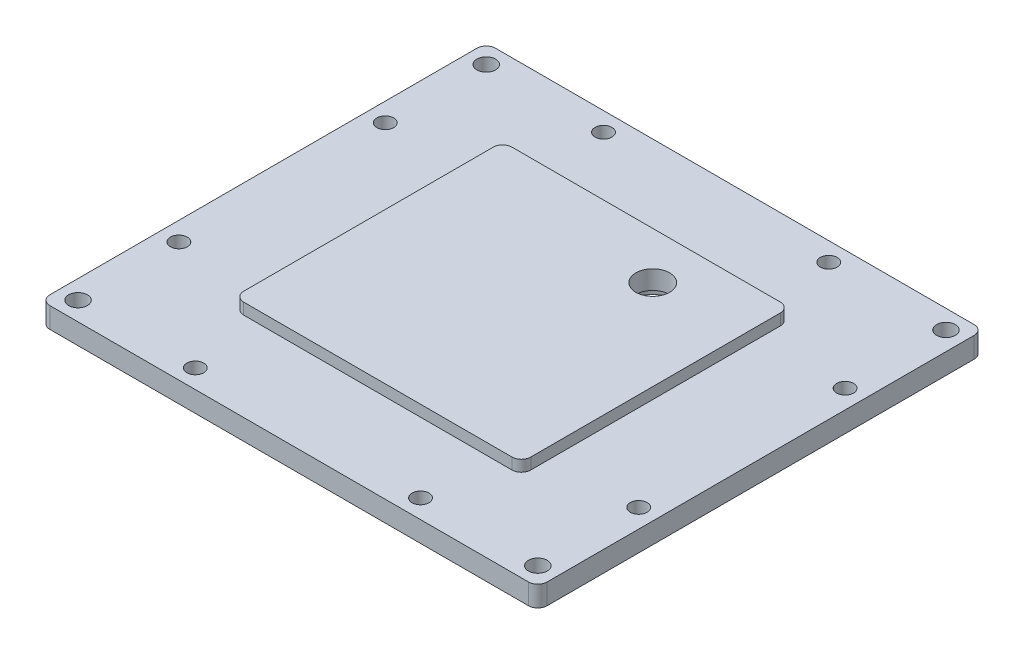
ISO-10303-21;
HEADER;
FILE_DESCRIPTION(('STEP AP214'),'2;1');
FILE_NAME('part.step','',(''),(''),'','','');
FILE_SCHEMA(('AUTOMOTIVE_DESIGN { 1 0 10303 214 1 1 1 1 }'));
ENDSEC;
DATA;
#1=APPLICATION_CONTEXT('core data for automotive mechanical design processes');
#2=APPLICATION_PROTOCOL_DEFINITION('international standard','automotive_design',2000,#1);
#3=PRODUCT_CONTEXT('',#1,'mechanical');
#4=PRODUCT('Part','Part','',(#3));
#5=PRODUCT_RELATED_PRODUCT_CATEGORY('part','',(#4));
#6=PRODUCT_DEFINITION_FORMATION('','',#4);
#7=PRODUCT_DEFINITION_CONTEXT('part definition',#1,'design');
#8=PRODUCT_DEFINITION('design','',#6,#7);
#9=PRODUCT_DEFINITION_SHAPE('','',#8);
#10=(LENGTH_UNIT() NAMED_UNIT(*) SI_UNIT(.MILLI.,.METRE.));
#11=(NAMED_UNIT(*) PLANE_ANGLE_UNIT() SI_UNIT($,.RADIAN.));
#12=(NAMED_UNIT(*) SI_UNIT($,.STERADIAN.) SOLID_ANGLE_UNIT());
#13=UNCERTAINTY_MEASURE_WITH_UNIT(LENGTH_MEASURE(1.E-05),#10,'distance_accuracy_value','');
#14=(GEOMETRIC_REPRESENTATION_CONTEXT(3) GLOBAL_UNCERTAINTY_ASSIGNED_CONTEXT((#13)) GLOBAL_UNIT_ASSIGNED_CONTEXT((#10,
#11,#12)) REPRESENTATION_CONTEXT('',''));
#15=CARTESIAN_POINT('',(0.,0.,0.));
#16=DIRECTION('',(0.,0.,1.));
#17=DIRECTION('',(1.,0.,0.));
#18=AXIS2_PLACEMENT_3D('',#15,#16,#17);
#19=CARTESIAN_POINT('',(57.,-11.,-93.));
#20=DIRECTION('',(0.,1.,0.));
#21=DIRECTION('',(0.,0.,1.));
#22=AXIS2_PLACEMENT_3D('',#19,#20,#21);
#23=CYLINDRICAL_SURFACE('',#22,18.);
#24=CARTESIAN_POINT('',(57.,23.,-93.));
#25=DIRECTION('',(0.,1.,0.));
#26=DIRECTION('',(0.,0.,1.));
#27=AXIS2_PLACEMENT_3D('',#24,#25,#26);
#28=CIRCLE('',#27,18.);
#29=CARTESIAN_POINT('',(57.,23.,-75.));
#30=VERTEX_POINT('',#29);
#31=EDGE_CURVE('E232',#30,#30,#28,.T.);
#32=ORIENTED_EDGE('',*,*,#31,.T.);
#33=EDGE_LOOP('',(#32));
#34=FACE_BOUND('',#33,.T.);
#35=CARTESIAN_POINT('',(57.,3.,-93.));
#36=DIRECTION('',(0.,-1.,0.));
#37=DIRECTION('',(0.,0.,-1.));
#38=AXIS2_PLACEMENT_3D('',#35,#36,#37);
#39=CIRCLE('',#38,18.);
#40=CARTESIAN_POINT('',(57.,3.,-111.));
#41=VERTEX_POINT('',#40);
#42=EDGE_CURVE('E228',#41,#41,#39,.F.);
#43=ORIENTED_EDGE('',*,*,#42,.F.);
#44=EDGE_LOOP('',(#43));
#45=FACE_BOUND('',#44,.T.);
#46=ADVANCED_FACE('F38',(#34,#45),#23,.F.);
#47=CARTESIAN_POINT('',(0.,11.,0.));
#48=DIRECTION('',(0.,-1.,0.));
#49=DIRECTION('',(0.,0.,-1.));
#50=AXIS2_PLACEMENT_3D('',#47,#48,#49);
#51=PLANE('',#50);
#52=CARTESIAN_POINT('',(120.,11.,217.5));
#53=DIRECTION('',(0.,1.,0.));
#54=DIRECTION('',(0.,0.,1.));
#55=AXIS2_PLACEMENT_3D('',#52,#53,#54);
#56=CIRCLE('',#55,9.);
#57=CARTESIAN_POINT('',(120.,11.,226.5));
#58=VERTEX_POINT('',#57);
#59=EDGE_CURVE('E387',#58,#58,#56,.T.);
#60=ORIENTED_EDGE('',*,*,#59,.F.);
#61=EDGE_LOOP('',(#60));
#62=FACE_BOUND('',#61,.T.);
#63=CARTESIAN_POINT('',(245.,11.,217.5));
#64=DIRECTION('',(0.,1.,0.));
#65=DIRECTION('',(0.,0.,1.));
#66=AXIS2_PLACEMENT_3D('',#63,#64,#65);
#67=CIRCLE('',#66,10.);
#68=CARTESIAN_POINT('',(245.,11.,227.5));
#69=VERTEX_POINT('',#68);
#70=EDGE_CURVE('E396',#69,#69,#67,.T.);
#71=ORIENTED_EDGE('',*,*,#70,.F.);
#72=EDGE_LOOP('',(#71));
#73=FACE_BOUND('',#72,.T.);
#74=CARTESIAN_POINT('',(245.,11.,110.));
#75=DIRECTION('',(0.,1.,0.));
#76=DIRECTION('',(0.,0.,1.));
#77=AXIS2_PLACEMENT_3D('',#74,#75,#76);
#78=CIRCLE('',#77,9.00000000000001);
#79=CARTESIAN_POINT('',(245.,11.,119.));
#80=VERTEX_POINT('',#79);
#81=EDGE_CURVE('E404',#80,#80,#78,.T.);
#82=ORIENTED_EDGE('',*,*,#81,.F.);
#83=EDGE_LOOP('',(#82));
#84=FACE_BOUND('',#83,.T.);
#85=CARTESIAN_POINT('',(245.,11.,-110.));
#86=DIRECTION('',(0.,1.,0.));
#87=DIRECTION('',(0.,0.,-1.));
#88=AXIS2_PLACEMENT_3D('',#85,#86,#87);
#89=CIRCLE('',#88,9.00000000000001);
#90=CARTESIAN_POINT('',(245.,11.,-119.));
#91=VERTEX_POINT('',#90);
#92=EDGE_CURVE('E412',#91,#91,#89,.T.);
#93=ORIENTED_EDGE('',*,*,#92,.F.);
#94=EDGE_LOOP('',(#93));
#95=FACE_BOUND('',#94,.T.);
#96=CARTESIAN_POINT('',(245.,11.,-217.5));
#97=DIRECTION('',(0.,1.,0.));
#98=DIRECTION('',(0.,0.,-1.));
#99=AXIS2_PLACEMENT_3D('',#96,#97,#98);
#100=CIRCLE('',#99,10.);
#101=CARTESIAN_POINT('',(245.,11.,-227.5));
#102=VERTEX_POINT('',#101);
#103=EDGE_CURVE('E355',#102,#102,#100,.T.);
#104=ORIENTED_EDGE('',*,*,#103,.F.);
#105=EDGE_LOOP('',(#104));
#106=FACE_BOUND('',#105,.T.);
#107=CARTESIAN_POINT('',(120.,11.,-217.5));
#108=DIRECTION('',(0.,1.,0.));
#109=DIRECTION('',(0.,0.,-1.));
#110=AXIS2_PLACEMENT_3D('',#107,#108,#109);
#111=CIRCLE('',#110,9.);
#112=CARTESIAN_POINT('',(120.,11.,-226.5));
#113=VERTEX_POINT('',#112);
#114=EDGE_CURVE('E364',#113,#113,#111,.T.);
#115=ORIENTED_EDGE('',*,*,#114,.F.);
#116=EDGE_LOOP('',(#115));
#117=FACE_BOUND('',#116,.T.);
#118=CARTESIAN_POINT('',(-245.,11.,-110.));
#119=DIRECTION('',(0.,1.,0.));
#120=DIRECTION('',(0.,0.,1.));
#121=AXIS2_PLACEMENT_3D('',#118,#119,#120);
#122=CIRCLE('',#121,9.00000000000001);
#123=CARTESIAN_POINT('',(-245.,11.,-101.));
#124=VERTEX_POINT('',#123);
#125=EDGE_CURVE('E372',#124,#124,#122,.T.);
#126=ORIENTED_EDGE('',*,*,#125,.F.);
#127=EDGE_LOOP('',(#126));
#128=FACE_BOUND('',#127,.T.);
#129=CARTESIAN_POINT('',(-120.,11.,-217.5));
#130=DIRECTION('',(0.,1.,0.));
#131=DIRECTION('',(0.,0.,1.));
#132=AXIS2_PLACEMENT_3D('',#129,#130,#131);
#133=CIRCLE('',#132,9.);
#134=CARTESIAN_POINT('',(-120.,11.,-208.5));
#135=VERTEX_POINT('',#134);
#136=EDGE_CURVE('E380',#135,#135,#133,.T.);
#137=ORIENTED_EDGE('',*,*,#136,.F.);
#138=EDGE_LOOP('',(#137));
#139=FACE_BOUND('',#138,.T.);
#140=CARTESIAN_POINT('',(-245.,11.,217.5));
#141=DIRECTION('',(0.,1.,0.));
#142=DIRECTION('',(0.,0.,-1.));
#143=AXIS2_PLACEMENT_3D('',#140,#141,#142);
#144=CIRCLE('',#143,10.);
#145=CARTESIAN_POINT('',(-245.,11.,207.5));
#146=VERTEX_POINT('',#145);
#147=EDGE_CURVE('E435',#146,#146,#144,.T.);
#148=ORIENTED_EDGE('',*,*,#147,.F.);
#149=EDGE_LOOP('',(#148));
#150=FACE_BOUND('',#149,.T.);
#151=CARTESIAN_POINT('',(-245.,11.,110.));
#152=DIRECTION('',(0.,1.,0.));
#153=DIRECTION('',(0.,0.,-1.));
#154=AXIS2_PLACEMENT_3D('',#151,#152,#153);
#155=CIRCLE('',#154,9.00000000000001);
#156=CARTESIAN_POINT('',(-245.,11.,101.));
#157=VERTEX_POINT('',#156);
#158=EDGE_CURVE('E419',#157,#157,#155,.T.);
#159=ORIENTED_EDGE('',*,*,#158,.F.);
#160=EDGE_LOOP('',(#159));
#161=FACE_BOUND('',#160,.T.);
#162=CARTESIAN_POINT('',(-120.,11.,217.5));
#163=DIRECTION('',(0.,1.,0.));
#164=DIRECTION('',(0.,0.,-1.));
#165=AXIS2_PLACEMENT_3D('',#162,#163,#164);
#166=CIRCLE('',#165,8.99999999999999);
#167=CARTESIAN_POINT('',(-120.,11.,208.5));
#168=VERTEX_POINT('',#167);
#169=EDGE_CURVE('E428',#168,#168,#166,.T.);
#170=ORIENTED_EDGE('',*,*,#169,.F.);
#171=EDGE_LOOP('',(#170));
#172=FACE_BOUND('',#171,.T.);
#173=CARTESIAN_POINT('',(-245.,11.,-217.5));
#174=DIRECTION('',(0.,1.,0.));
#175=DIRECTION('',(0.,0.,1.));
#176=AXIS2_PLACEMENT_3D('',#173,#174,#175);
#177=CIRCLE('',#176,10.);
#178=CARTESIAN_POINT('',(-245.,11.,-207.5));
#179=VERTEX_POINT('',#178);
#180=EDGE_CURVE('E347',#179,#179,#177,.T.);
#181=ORIENTED_EDGE('',*,*,#180,.F.);
#182=EDGE_LOOP('',(#181));
#183=FACE_BOUND('',#182,.T.);
#184=DIRECTION('',(0.,0.,-1.));
#185=VECTOR('',#184,1.);
#186=CARTESIAN_POINT('',(265.,11.,237.5));
#187=LINE('',#186,#185);
#188=CARTESIAN_POINT('',(265.,11.,227.5));
#189=VERTEX_POINT('',#188);
#190=CARTESIAN_POINT('',(265.,11.,-227.5));
#191=VERTEX_POINT('',#190);
#192=EDGE_CURVE('E198',#189,#191,#187,.T.);
#193=ORIENTED_EDGE('',*,*,#192,.T.);
#194=CARTESIAN_POINT('',(255.,11.,-227.5));
#195=DIRECTION('',(0.,-1.,0.));
#196=DIRECTION('',(0.,0.,-1.));
#197=AXIS2_PLACEMENT_3D('',#194,#195,#196);
#198=CIRCLE('',#197,10.);
#199=CARTESIAN_POINT('',(255.,11.,-237.5));
#200=VERTEX_POINT('',#199);
#201=EDGE_CURVE('E301',#191,#200,#198,.F.);
#202=ORIENTED_EDGE('',*,*,#201,.T.);
#203=DIRECTION('',(-1.,0.,0.));
#204=VECTOR('',#203,1.);
#205=CARTESIAN_POINT('',(-265.,11.,-237.5));
#206=LINE('',#205,#204);
#207=CARTESIAN_POINT('',(-255.,11.,-237.5));
#208=VERTEX_POINT('',#207);
#209=EDGE_CURVE('E202',#200,#208,#206,.T.);
#210=ORIENTED_EDGE('',*,*,#209,.T.);
#211=CARTESIAN_POINT('',(-255.,11.,-227.5));
#212=DIRECTION('',(0.,-1.,0.));
#213=DIRECTION('',(0.,0.,-1.));
#214=AXIS2_PLACEMENT_3D('',#211,#212,#213);
#215=CIRCLE('',#214,10.);
#216=CARTESIAN_POINT('',(-265.,11.,-227.5));
#217=VERTEX_POINT('',#216);
#218=EDGE_CURVE('E295',#208,#217,#215,.F.);
#219=ORIENTED_EDGE('',*,*,#218,.T.);
#220=DIRECTION('',(0.,0.,1.));
#221=VECTOR('',#220,1.);
#222=CARTESIAN_POINT('',(-265.,11.,237.5));
#223=LINE('',#222,#221);
#224=CARTESIAN_POINT('',(-265.,11.,227.5));
#225=VERTEX_POINT('',#224);
#226=EDGE_CURVE('E207',#217,#225,#223,.T.);
#227=ORIENTED_EDGE('',*,*,#226,.T.);
#228=CARTESIAN_POINT('',(-255.,11.,227.5));
#229=DIRECTION('',(0.,-1.,0.));
#230=DIRECTION('',(0.,0.,-1.));
#231=AXIS2_PLACEMENT_3D('',#228,#229,#230);
#232=CIRCLE('',#231,10.);
#233=CARTESIAN_POINT('',(-255.,11.,237.5));
#234=VERTEX_POINT('',#233);
#235=EDGE_CURVE('E61',#225,#234,#232,.F.);
#236=ORIENTED_EDGE('',*,*,#235,.T.);
#237=DIRECTION('',(1.,0.,0.));
#238=VECTOR('',#237,1.);
#239=CARTESIAN_POINT('',(-265.,11.,237.5));
#240=LINE('',#239,#238);
#241=CARTESIAN_POINT('',(255.,11.,237.5));
#242=VERTEX_POINT('',#241);
#243=EDGE_CURVE('E210',#234,#242,#240,.T.);
#244=ORIENTED_EDGE('',*,*,#243,.T.);
#245=CARTESIAN_POINT('',(255.,11.,227.5));
#246=DIRECTION('',(0.,-1.,0.));
#247=DIRECTION('',(0.,0.,-1.));
#248=AXIS2_PLACEMENT_3D('',#245,#246,#247);
#249=CIRCLE('',#248,10.);
#250=EDGE_CURVE('E298',#242,#189,#249,.F.);
#251=ORIENTED_EDGE('',*,*,#250,.T.);
#252=EDGE_LOOP('',(#193,#202,#210,#219,#227,#236,#244,#251));
#253=FACE_BOUND('',#252,.T.);
#254=DIRECTION('',(0.,0.,-1.));
#255=VECTOR('',#254,1.);
#256=CARTESIAN_POINT('',(153.,11.,143.));
#257=LINE('',#256,#255);
#258=CARTESIAN_POINT('',(153.,11.,133.));
#259=VERTEX_POINT('',#258);
#260=CARTESIAN_POINT('',(153.,11.,-133.));
#261=VERTEX_POINT('',#260);
#262=EDGE_CURVE('E183',#259,#261,#257,.T.);
#263=ORIENTED_EDGE('',*,*,#262,.F.);
#264=CARTESIAN_POINT('',(143.,11.,133.));
#265=DIRECTION('',(0.,-1.,0.));
#266=DIRECTION('',(0.,0.,-1.));
#267=AXIS2_PLACEMENT_3D('',#264,#265,#266);
#268=CIRCLE('',#267,10.);
#269=CARTESIAN_POINT('',(143.,11.,143.));
#270=VERTEX_POINT('',#269);
#271=EDGE_CURVE('E11',#259,#270,#268,.T.);
#272=ORIENTED_EDGE('',*,*,#271,.T.);
#273=DIRECTION('',(1.,0.,0.));
#274=VECTOR('',#273,1.);
#275=CARTESIAN_POINT('',(-153.,11.,143.));
#276=LINE('',#275,#274);
#277=CARTESIAN_POINT('',(-143.,11.,143.));
#278=VERTEX_POINT('',#277);
#279=EDGE_CURVE('E188',#278,#270,#276,.T.);
#280=ORIENTED_EDGE('',*,*,#279,.F.);
#281=CARTESIAN_POINT('',(-143.,11.,133.));
#282=DIRECTION('',(0.,-1.,0.));
#283=DIRECTION('',(0.,0.,-1.));
#284=AXIS2_PLACEMENT_3D('',#281,#282,#283);
#285=CIRCLE('',#284,10.);
#286=CARTESIAN_POINT('',(-153.,11.,133.));
#287=VERTEX_POINT('',#286);
#288=EDGE_CURVE('E47',#278,#287,#285,.T.);
#289=ORIENTED_EDGE('',*,*,#288,.T.);
#290=DIRECTION('',(0.,0.,1.));
#291=VECTOR('',#290,1.);
#292=CARTESIAN_POINT('',(-153.,11.,143.));
#293=LINE('',#292,#291);
#294=CARTESIAN_POINT('',(-153.,11.,-133.));
#295=VERTEX_POINT('',#294);
#296=EDGE_CURVE('E182',#295,#287,#293,.T.);
#297=ORIENTED_EDGE('',*,*,#296,.F.);
#298=CARTESIAN_POINT('',(-143.,11.,-133.));
#299=DIRECTION('',(0.,-1.,0.));
#300=DIRECTION('',(0.,0.,-1.));
#301=AXIS2_PLACEMENT_3D('',#298,#299,#300);
#302=CIRCLE('',#301,10.);
#303=CARTESIAN_POINT('',(-143.,11.,-143.));
#304=VERTEX_POINT('',#303);
#305=EDGE_CURVE('E164',#295,#304,#302,.T.);
#306=ORIENTED_EDGE('',*,*,#305,.T.);
#307=DIRECTION('',(-1.,0.,0.));
#308=VECTOR('',#307,1.);
#309=CARTESIAN_POINT('',(-153.,11.,-143.));
#310=LINE('',#309,#308);
#311=CARTESIAN_POINT('',(143.,11.,-143.));
#312=VERTEX_POINT('',#311);
#313=EDGE_CURVE('E171',#312,#304,#310,.T.);
#314=ORIENTED_EDGE('',*,*,#313,.F.);
#315=CARTESIAN_POINT('',(143.,11.,-133.));
#316=DIRECTION('',(0.,-1.,0.));
#317=DIRECTION('',(0.,0.,-1.));
#318=AXIS2_PLACEMENT_3D('',#315,#316,#317);
#319=CIRCLE('',#318,10.);
#320=EDGE_CURVE('E153',#312,#261,#319,.T.);
#321=ORIENTED_EDGE('',*,*,#320,.T.);
#322=EDGE_LOOP('',(#263,#272,#280,#289,#297,#306,#314,#321));
#323=FACE_BOUND('',#322,.T.);
#324=ADVANCED_FACE('F179',(#62,#73,#84,#95,#106,#117,#128,#139,#150,#161,#172,#183,#253,#323),
#51,.F.);
#325=CARTESIAN_POINT('',(265.,11.,237.5));
#326=DIRECTION('',(-1.,0.,0.));
#327=DIRECTION('',(0.,0.,1.));
#328=AXIS2_PLACEMENT_3D('',#325,#326,#327);
#329=PLANE('',#328);
#330=DIRECTION('',(0.,0.,-1.));
#331=VECTOR('',#330,1.);
#332=CARTESIAN_POINT('',(265.,-11.,237.5));
#333=LINE('',#332,#331);
#334=CARTESIAN_POINT('',(265.,-11.,227.5));
#335=VERTEX_POINT('',#334);
#336=CARTESIAN_POINT('',(265.,-11.,-227.5));
#337=VERTEX_POINT('',#336);
#338=EDGE_CURVE('E213',#335,#337,#333,.T.);
#339=ORIENTED_EDGE('',*,*,#338,.T.);
#340=DIRECTION('',(0.,-1.,0.));
#341=VECTOR('',#340,1.);
#342=CARTESIAN_POINT('',(265.,11.,-227.5));
#343=LINE('',#342,#341);
#344=EDGE_CURVE('E290',#337,#191,#343,.F.);
#345=ORIENTED_EDGE('',*,*,#344,.T.);
#346=ORIENTED_EDGE('',*,*,#192,.F.);
#347=DIRECTION('',(0.,-1.,0.));
#348=VECTOR('',#347,1.);
#349=CARTESIAN_POINT('',(265.,11.,227.5));
#350=LINE('',#349,#348);
#351=EDGE_CURVE('E286',#189,#335,#350,.T.);
#352=ORIENTED_EDGE('',*,*,#351,.T.);
#353=EDGE_LOOP('',(#339,#345,#346,#352));
#354=FACE_BOUND('',#353,.T.);
#355=ADVANCED_FACE('F517',(#354),#329,.F.);
#356=CARTESIAN_POINT('',(-265.,11.,-237.5));
#357=DIRECTION('',(0.,0.,1.));
#358=DIRECTION('',(1.,0.,0.));
#359=AXIS2_PLACEMENT_3D('',#356,#357,#358);
#360=PLANE('',#359);
#361=ORIENTED_EDGE('',*,*,#209,.F.);
#362=DIRECTION('',(0.,-1.,0.));
#363=VECTOR('',#362,1.);
#364=CARTESIAN_POINT('',(255.,11.,-237.5));
#365=LINE('',#364,#363);
#366=CARTESIAN_POINT('',(255.,-11.,-237.5));
#367=VERTEX_POINT('',#366);
#368=EDGE_CURVE('E270',#200,#367,#365,.T.);
#369=ORIENTED_EDGE('',*,*,#368,.T.);
#370=DIRECTION('',(-1.,0.,0.));
#371=VECTOR('',#370,1.);
#372=CARTESIAN_POINT('',(-265.,-11.,-237.5));
#373=LINE('',#372,#371);
#374=CARTESIAN_POINT('',(-255.,-11.,-237.5));
#375=VERTEX_POINT('',#374);
#376=EDGE_CURVE('E217',#367,#375,#373,.T.);
#377=ORIENTED_EDGE('',*,*,#376,.T.);
#378=DIRECTION('',(0.,-1.,0.));
#379=VECTOR('',#378,1.);
#380=CARTESIAN_POINT('',(-255.,11.,-237.5));
#381=LINE('',#380,#379);
#382=EDGE_CURVE('E267',#375,#208,#381,.F.);
#383=ORIENTED_EDGE('',*,*,#382,.T.);
#384=EDGE_LOOP('',(#361,#369,#377,#383));
#385=FACE_BOUND('',#384,.T.);
#386=ADVANCED_FACE('F498',(#385),#360,.F.);
#387=CARTESIAN_POINT('',(-265.,11.,237.5));
#388=DIRECTION('',(1.,0.,0.));
#389=DIRECTION('',(0.,0.,-1.));
#390=AXIS2_PLACEMENT_3D('',#387,#388,#389);
#391=PLANE('',#390);
#392=ORIENTED_EDGE('',*,*,#226,.F.);
#393=DIRECTION('',(0.,-1.,0.));
#394=VECTOR('',#393,1.);
#395=CARTESIAN_POINT('',(-265.,11.,-227.5));
#396=LINE('',#395,#394);
#397=CARTESIAN_POINT('',(-265.,-11.,-227.5));
#398=VERTEX_POINT('',#397);
#399=EDGE_CURVE('E165',#217,#398,#396,.T.);
#400=ORIENTED_EDGE('',*,*,#399,.T.);
#401=DIRECTION('',(0.,0.,1.));
#402=VECTOR('',#401,1.);
#403=CARTESIAN_POINT('',(-265.,-11.,237.5));
#404=LINE('',#403,#402);
#405=CARTESIAN_POINT('',(-265.,-11.,227.5));
#406=VERTEX_POINT('',#405);
#407=EDGE_CURVE('E222',#398,#406,#404,.T.);
#408=ORIENTED_EDGE('',*,*,#407,.T.);
#409=DIRECTION('',(0.,-1.,0.));
#410=VECTOR('',#409,1.);
#411=CARTESIAN_POINT('',(-265.,11.,227.5));
#412=LINE('',#411,#410);
#413=EDGE_CURVE('E310',#406,#225,#412,.F.);
#414=ORIENTED_EDGE('',*,*,#413,.T.);
#415=EDGE_LOOP('',(#392,#400,#408,#414));
#416=FACE_BOUND('',#415,.T.);
#417=ADVANCED_FACE('F506',(#416),#391,.F.);
#418=CARTESIAN_POINT('',(-265.,11.,237.5));
#419=DIRECTION('',(0.,0.,-1.));
#420=DIRECTION('',(-1.,0.,0.));
#421=AXIS2_PLACEMENT_3D('',#418,#419,#420);
#422=PLANE('',#421);
#423=DIRECTION('',(1.,0.,0.));
#424=VECTOR('',#423,1.);
#425=CARTESIAN_POINT('',(-265.,-11.,237.5));
#426=LINE('',#425,#424);
#427=CARTESIAN_POINT('',(-255.,-11.,237.5));
#428=VERTEX_POINT('',#427);
#429=CARTESIAN_POINT('',(255.,-11.,237.5));
#430=VERTEX_POINT('',#429);
#431=EDGE_CURVE('E203',#428,#430,#426,.T.);
#432=ORIENTED_EDGE('',*,*,#431,.T.);
#433=DIRECTION('',(0.,-1.,0.));
#434=VECTOR('',#433,1.);
#435=CARTESIAN_POINT('',(255.,11.,237.5));
#436=LINE('',#435,#434);
#437=EDGE_CURVE('E54',#430,#242,#436,.F.);
#438=ORIENTED_EDGE('',*,*,#437,.T.);
#439=ORIENTED_EDGE('',*,*,#243,.F.);
#440=DIRECTION('',(0.,-1.,0.));
#441=VECTOR('',#440,1.);
#442=CARTESIAN_POINT('',(-255.,11.,237.5));
#443=LINE('',#442,#441);
#444=EDGE_CURVE('E304',#234,#428,#443,.T.);
#445=ORIENTED_EDGE('',*,*,#444,.T.);
#446=EDGE_LOOP('',(#432,#438,#439,#445));
#447=FACE_BOUND('',#446,.T.);
#448=ADVANCED_FACE('F466',(#447),#422,.F.);
#449=CARTESIAN_POINT('',(0.,-11.,0.));
#450=DIRECTION('',(0.,-1.,0.));
#451=DIRECTION('',(0.,0.,-1.));
#452=AXIS2_PLACEMENT_3D('',#449,#450,#451);
#453=PLANE('',#452);
#454=CARTESIAN_POINT('',(57.,-11.,-93.));
#455=DIRECTION('',(0.,-1.,0.));
#456=DIRECTION('',(0.,0.,-1.));
#457=AXIS2_PLACEMENT_3D('',#454,#455,#456);
#458=CIRCLE('',#457,32.5);
#459=CARTESIAN_POINT('',(57.,-11.,-125.5));
#460=VERTEX_POINT('',#459);
#461=EDGE_CURVE('E445',#460,#460,#458,.T.);
#462=ORIENTED_EDGE('',*,*,#461,.F.);
#463=EDGE_LOOP('',(#462));
#464=FACE_BOUND('',#463,.T.);
#465=CARTESIAN_POINT('',(120.,-11.,217.5));
#466=DIRECTION('',(0.,1.,0.));
#467=DIRECTION('',(0.,0.,1.));
#468=AXIS2_PLACEMENT_3D('',#465,#466,#467);
#469=CIRCLE('',#468,9.);
#470=CARTESIAN_POINT('',(120.,-11.,226.5));
#471=VERTEX_POINT('',#470);
#472=EDGE_CURVE('E391',#471,#471,#469,.T.);
#473=ORIENTED_EDGE('',*,*,#472,.T.);
#474=EDGE_LOOP('',(#473));
#475=FACE_BOUND('',#474,.T.);
#476=CARTESIAN_POINT('',(245.,-11.,217.5));
#477=DIRECTION('',(0.,1.,0.));
#478=DIRECTION('',(0.,0.,1.));
#479=AXIS2_PLACEMENT_3D('',#476,#477,#478);
#480=CIRCLE('',#479,10.);
#481=CARTESIAN_POINT('',(245.,-11.,227.5));
#482=VERTEX_POINT('',#481);
#483=EDGE_CURVE('E400',#482,#482,#480,.T.);
#484=ORIENTED_EDGE('',*,*,#483,.T.);
#485=EDGE_LOOP('',(#484));
#486=FACE_BOUND('',#485,.T.);
#487=CARTESIAN_POINT('',(245.,-11.,110.));
#488=DIRECTION('',(0.,1.,0.));
#489=DIRECTION('',(0.,0.,1.));
#490=AXIS2_PLACEMENT_3D('',#487,#488,#489);
#491=CIRCLE('',#490,9.00000000000001);
#492=CARTESIAN_POINT('',(245.,-11.,119.));
#493=VERTEX_POINT('',#492);
#494=EDGE_CURVE('E408',#493,#493,#491,.T.);
#495=ORIENTED_EDGE('',*,*,#494,.T.);
#496=EDGE_LOOP('',(#495));
#497=FACE_BOUND('',#496,.T.);
#498=CARTESIAN_POINT('',(245.,-11.,-110.));
#499=DIRECTION('',(0.,1.,0.));
#500=DIRECTION('',(0.,0.,-1.));
#501=AXIS2_PLACEMENT_3D('',#498,#499,#500);
#502=CIRCLE('',#501,9.00000000000001);
#503=CARTESIAN_POINT('',(245.,-11.,-119.));
#504=VERTEX_POINT('',#503);
#505=EDGE_CURVE('E360',#504,#504,#502,.T.);
#506=ORIENTED_EDGE('',*,*,#505,.T.);
#507=EDGE_LOOP('',(#506));
#508=FACE_BOUND('',#507,.T.);
#509=CARTESIAN_POINT('',(245.,-11.,-217.5));
#510=DIRECTION('',(0.,1.,0.));
#511=DIRECTION('',(0.,0.,-1.));
#512=AXIS2_PLACEMENT_3D('',#509,#510,#511);
#513=CIRCLE('',#512,10.);
#514=CARTESIAN_POINT('',(245.,-11.,-227.5));
#515=VERTEX_POINT('',#514);
#516=EDGE_CURVE('E359',#515,#515,#513,.T.);
#517=ORIENTED_EDGE('',*,*,#516,.T.);
#518=EDGE_LOOP('',(#517));
#519=FACE_BOUND('',#518,.T.);
#520=CARTESIAN_POINT('',(120.,-11.,-217.5));
#521=DIRECTION('',(0.,1.,0.));
#522=DIRECTION('',(0.,0.,-1.));
#523=AXIS2_PLACEMENT_3D('',#520,#521,#522);
#524=CIRCLE('',#523,9.);
#525=CARTESIAN_POINT('',(120.,-11.,-226.5));
#526=VERTEX_POINT('',#525);
#527=EDGE_CURVE('E368',#526,#526,#524,.T.);
#528=ORIENTED_EDGE('',*,*,#527,.T.);
#529=EDGE_LOOP('',(#528));
#530=FACE_BOUND('',#529,.T.);
#531=CARTESIAN_POINT('',(-245.,-11.,-110.));
#532=DIRECTION('',(0.,1.,0.));
#533=DIRECTION('',(0.,0.,1.));
#534=AXIS2_PLACEMENT_3D('',#531,#532,#533);
#535=CIRCLE('',#534,9.00000000000001);
#536=CARTESIAN_POINT('',(-245.,-11.,-101.));
#537=VERTEX_POINT('',#536);
#538=EDGE_CURVE('E376',#537,#537,#535,.T.);
#539=ORIENTED_EDGE('',*,*,#538,.T.);
#540=EDGE_LOOP('',(#539));
#541=FACE_BOUND('',#540,.T.);
#542=CARTESIAN_POINT('',(-120.,-11.,-217.5));
#543=DIRECTION('',(0.,1.,0.));
#544=DIRECTION('',(0.,0.,1.));
#545=AXIS2_PLACEMENT_3D('',#542,#543,#544);
#546=CIRCLE('',#545,9.);
#547=CARTESIAN_POINT('',(-120.,-11.,-208.5));
#548=VERTEX_POINT('',#547);
#549=EDGE_CURVE('E351',#548,#548,#546,.T.);
#550=ORIENTED_EDGE('',*,*,#549,.T.);
#551=EDGE_LOOP('',(#550));
#552=FACE_BOUND('',#551,.T.);
#553=CARTESIAN_POINT('',(-245.,-11.,217.5));
#554=DIRECTION('',(0.,1.,0.));
#555=DIRECTION('',(0.,0.,-1.));
#556=AXIS2_PLACEMENT_3D('',#553,#554,#555);
#557=CIRCLE('',#556,10.);
#558=CARTESIAN_POINT('',(-245.,-11.,207.5));
#559=VERTEX_POINT('',#558);
#560=EDGE_CURVE('E424',#559,#559,#557,.T.);
#561=ORIENTED_EDGE('',*,*,#560,.T.);
#562=EDGE_LOOP('',(#561));
#563=FACE_BOUND('',#562,.T.);
#564=CARTESIAN_POINT('',(-245.,-11.,110.));
#565=DIRECTION('',(0.,1.,0.));
#566=DIRECTION('',(0.,0.,-1.));
#567=AXIS2_PLACEMENT_3D('',#564,#565,#566);
#568=CIRCLE('',#567,9.00000000000001);
#569=CARTESIAN_POINT('',(-245.,-11.,101.));
#570=VERTEX_POINT('',#569);
#571=EDGE_CURVE('E423',#570,#570,#568,.T.);
#572=ORIENTED_EDGE('',*,*,#571,.T.);
#573=EDGE_LOOP('',(#572));
#574=FACE_BOUND('',#573,.T.);
#575=CARTESIAN_POINT('',(-120.,-11.,217.5));
#576=DIRECTION('',(0.,1.,0.));
#577=DIRECTION('',(0.,0.,-1.));
#578=AXIS2_PLACEMENT_3D('',#575,#576,#577);
#579=CIRCLE('',#578,8.99999999999999);
#580=CARTESIAN_POINT('',(-120.,-11.,208.5));
#581=VERTEX_POINT('',#580);
#582=EDGE_CURVE('E392',#581,#581,#579,.T.);
#583=ORIENTED_EDGE('',*,*,#582,.T.);
#584=EDGE_LOOP('',(#583));
#585=FACE_BOUND('',#584,.T.);
#586=CARTESIAN_POINT('',(-245.,-11.,-217.5));
#587=DIRECTION('',(0.,1.,0.));
#588=DIRECTION('',(0.,0.,1.));
#589=AXIS2_PLACEMENT_3D('',#586,#587,#588);
#590=CIRCLE('',#589,10.);
#591=CARTESIAN_POINT('',(-245.,-11.,-207.5));
#592=VERTEX_POINT('',#591);
#593=EDGE_CURVE('E190',#592,#592,#590,.T.);
#594=ORIENTED_EDGE('',*,*,#593,.T.);
#595=EDGE_LOOP('',(#594));
#596=FACE_BOUND('',#595,.T.);
#597=ORIENTED_EDGE('',*,*,#376,.F.);
#598=CARTESIAN_POINT('',(255.,-11.,-227.5));
#599=DIRECTION('',(0.,-1.,0.));
#600=DIRECTION('',(0.,0.,-1.));
#601=AXIS2_PLACEMENT_3D('',#598,#599,#600);
#602=CIRCLE('',#601,10.);
#603=EDGE_CURVE('E283',#367,#337,#602,.T.);
#604=ORIENTED_EDGE('',*,*,#603,.T.);
#605=ORIENTED_EDGE('',*,*,#338,.F.);
#606=CARTESIAN_POINT('',(255.,-11.,227.5));
#607=DIRECTION('',(0.,-1.,0.));
#608=DIRECTION('',(0.,0.,-1.));
#609=AXIS2_PLACEMENT_3D('',#606,#607,#608);
#610=CIRCLE('',#609,10.);
#611=EDGE_CURVE('E280',#335,#430,#610,.T.);
#612=ORIENTED_EDGE('',*,*,#611,.T.);
#613=ORIENTED_EDGE('',*,*,#431,.F.);
#614=CARTESIAN_POINT('',(-255.,-11.,227.5));
#615=DIRECTION('',(0.,-1.,0.));
#616=DIRECTION('',(0.,0.,-1.));
#617=AXIS2_PLACEMENT_3D('',#614,#615,#616);
#618=CIRCLE('',#617,10.);
#619=EDGE_CURVE('E274',#428,#406,#618,.T.);
#620=ORIENTED_EDGE('',*,*,#619,.T.);
#621=ORIENTED_EDGE('',*,*,#407,.F.);
#622=CARTESIAN_POINT('',(-255.,-11.,-227.5));
#623=DIRECTION('',(0.,-1.,0.));
#624=DIRECTION('',(0.,0.,-1.));
#625=AXIS2_PLACEMENT_3D('',#622,#623,#624);
#626=CIRCLE('',#625,10.);
#627=EDGE_CURVE('E277',#398,#375,#626,.T.);
#628=ORIENTED_EDGE('',*,*,#627,.T.);
#629=EDGE_LOOP('',(#597,#604,#605,#612,#613,#620,#621,#628));
#630=FACE_BOUND('',#629,.T.);
#631=ADVANCED_FACE('F462',(#464,#475,#486,#497,#508,#519,#530,#541,#552,#563,#574,#585,#596,
#630),#453,.T.);
#632=CARTESIAN_POINT('',(153.,23.,143.));
#633=DIRECTION('',(-1.,0.,0.));
#634=DIRECTION('',(0.,0.,1.));
#635=AXIS2_PLACEMENT_3D('',#632,#633,#634);
#636=PLANE('',#635);
#637=ORIENTED_EDGE('',*,*,#262,.T.);
#638=DIRECTION('',(0.,-1.,0.));
#639=VECTOR('',#638,1.);
#640=CARTESIAN_POINT('',(153.,23.,-133.));
#641=LINE('',#640,#639);
#642=CARTESIAN_POINT('',(153.,23.,-133.));
#643=VERTEX_POINT('',#642);
#644=EDGE_CURVE('E158',#261,#643,#641,.F.);
#645=ORIENTED_EDGE('',*,*,#644,.T.);
#646=DIRECTION('',(0.,0.,-1.));
#647=VECTOR('',#646,1.);
#648=CARTESIAN_POINT('',(153.,23.,143.));
#649=LINE('',#648,#647);
#650=CARTESIAN_POINT('',(153.,23.,133.));
#651=VERTEX_POINT('',#650);
#652=EDGE_CURVE('E197',#651,#643,#649,.T.);
#653=ORIENTED_EDGE('',*,*,#652,.F.);
#654=DIRECTION('',(0.,-1.,0.));
#655=VECTOR('',#654,1.);
#656=CARTESIAN_POINT('',(153.,23.,133.));
#657=LINE('',#656,#655);
#658=EDGE_CURVE('E176',#651,#259,#657,.T.);
#659=ORIENTED_EDGE('',*,*,#658,.T.);
#660=EDGE_LOOP('',(#637,#645,#653,#659));
#661=FACE_BOUND('',#660,.T.);
#662=ADVANCED_FACE('F465',(#661),#636,.F.);
#663=CARTESIAN_POINT('',(-153.,23.,-143.));
#664=DIRECTION('',(0.,0.,1.));
#665=DIRECTION('',(1.,0.,0.));
#666=AXIS2_PLACEMENT_3D('',#663,#664,#665);
#667=PLANE('',#666);
#668=DIRECTION('',(-1.,0.,0.));
#669=VECTOR('',#668,1.);
#670=CARTESIAN_POINT('',(-153.,23.,-143.));
#671=LINE('',#670,#669);
#672=CARTESIAN_POINT('',(143.,23.,-143.));
#673=VERTEX_POINT('',#672);
#674=CARTESIAN_POINT('',(-143.,23.,-143.));
#675=VERTEX_POINT('',#674);
#676=EDGE_CURVE('E174',#673,#675,#671,.T.);
#677=ORIENTED_EDGE('',*,*,#676,.F.);
#678=DIRECTION('',(0.,-1.,0.));
#679=VECTOR('',#678,1.);
#680=CARTESIAN_POINT('',(143.,23.,-143.));
#681=LINE('',#680,#679);
#682=EDGE_CURVE('E157',#673,#312,#681,.T.);
#683=ORIENTED_EDGE('',*,*,#682,.T.);
#684=ORIENTED_EDGE('',*,*,#313,.T.);
#685=DIRECTION('',(0.,-1.,0.));
#686=VECTOR('',#685,1.);
#687=CARTESIAN_POINT('',(-143.,23.,-143.));
#688=LINE('',#687,#686);
#689=EDGE_CURVE('E177',#304,#675,#688,.F.);
#690=ORIENTED_EDGE('',*,*,#689,.T.);
#691=EDGE_LOOP('',(#677,#683,#684,#690));
#692=FACE_BOUND('',#691,.T.);
#693=ADVANCED_FACE('F170',(#692),#667,.F.);
#694=CARTESIAN_POINT('',(-153.,23.,143.));
#695=DIRECTION('',(1.,0.,0.));
#696=DIRECTION('',(0.,0.,-1.));
#697=AXIS2_PLACEMENT_3D('',#694,#695,#696);
#698=PLANE('',#697);
#699=DIRECTION('',(0.,0.,1.));
#700=VECTOR('',#699,1.);
#701=CARTESIAN_POINT('',(-153.,23.,143.));
#702=LINE('',#701,#700);
#703=CARTESIAN_POINT('',(-153.,23.,-133.));
#704=VERTEX_POINT('',#703);
#705=CARTESIAN_POINT('',(-153.,23.,133.));
#706=VERTEX_POINT('',#705);
#707=EDGE_CURVE('E335',#704,#706,#702,.T.);
#708=ORIENTED_EDGE('',*,*,#707,.F.);
#709=DIRECTION('',(0.,-1.,0.));
#710=VECTOR('',#709,1.);
#711=CARTESIAN_POINT('',(-153.,23.,-133.));
#712=LINE('',#711,#710);
#713=EDGE_CURVE('E256',#704,#295,#712,.T.);
#714=ORIENTED_EDGE('',*,*,#713,.T.);
#715=ORIENTED_EDGE('',*,*,#296,.T.);
#716=DIRECTION('',(0.,-1.,0.));
#717=VECTOR('',#716,1.);
#718=CARTESIAN_POINT('',(-153.,23.,133.));
#719=LINE('',#718,#717);
#720=EDGE_CURVE('E253',#287,#706,#719,.F.);
#721=ORIENTED_EDGE('',*,*,#720,.T.);
#722=EDGE_LOOP('',(#708,#714,#715,#721));
#723=FACE_BOUND('',#722,.T.);
#724=ADVANCED_FACE('F324',(#723),#698,.F.);
#725=CARTESIAN_POINT('',(-153.,23.,143.));
#726=DIRECTION('',(0.,0.,-1.));
#727=DIRECTION('',(-1.,0.,0.));
#728=AXIS2_PLACEMENT_3D('',#725,#726,#727);
#729=PLANE('',#728);
#730=DIRECTION('',(1.,0.,0.));
#731=VECTOR('',#730,1.);
#732=CARTESIAN_POINT('',(-153.,23.,143.));
#733=LINE('',#732,#731);
#734=CARTESIAN_POINT('',(-143.,23.,143.));
#735=VERTEX_POINT('',#734);
#736=CARTESIAN_POINT('',(143.,23.,143.));
#737=VERTEX_POINT('',#736);
#738=EDGE_CURVE('E218',#735,#737,#733,.T.);
#739=ORIENTED_EDGE('',*,*,#738,.F.);
#740=DIRECTION('',(0.,-1.,0.));
#741=VECTOR('',#740,1.);
#742=CARTESIAN_POINT('',(-143.,23.,143.));
#743=LINE('',#742,#741);
#744=EDGE_CURVE('E263',#735,#278,#743,.T.);
#745=ORIENTED_EDGE('',*,*,#744,.T.);
#746=ORIENTED_EDGE('',*,*,#279,.T.);
#747=DIRECTION('',(0.,-1.,0.));
#748=VECTOR('',#747,1.);
#749=CARTESIAN_POINT('',(143.,23.,143.));
#750=LINE('',#749,#748);
#751=EDGE_CURVE('E260',#270,#737,#750,.F.);
#752=ORIENTED_EDGE('',*,*,#751,.T.);
#753=EDGE_LOOP('',(#739,#745,#746,#752));
#754=FACE_BOUND('',#753,.T.);
#755=ADVANCED_FACE('F337',(#754),#729,.F.);
#756=CARTESIAN_POINT('',(0.,23.,0.));
#757=DIRECTION('',(0.,-1.,0.));
#758=DIRECTION('',(0.,0.,-1.));
#759=AXIS2_PLACEMENT_3D('',#756,#757,#758);
#760=PLANE('',#759);
#761=ORIENTED_EDGE('',*,*,#31,.F.);
#762=EDGE_LOOP('',(#761));
#763=FACE_BOUND('',#762,.T.);
#764=ORIENTED_EDGE('',*,*,#652,.T.);
#765=CARTESIAN_POINT('',(143.,23.,-133.));
#766=DIRECTION('',(0.,-1.,0.));
#767=DIRECTION('',(0.,0.,-1.));
#768=AXIS2_PLACEMENT_3D('',#765,#766,#767);
#769=CIRCLE('',#768,10.);
#770=EDGE_CURVE('E250',#643,#673,#769,.F.);
#771=ORIENTED_EDGE('',*,*,#770,.T.);
#772=ORIENTED_EDGE('',*,*,#676,.T.);
#773=CARTESIAN_POINT('',(-143.,23.,-133.));
#774=DIRECTION('',(0.,-1.,0.));
#775=DIRECTION('',(0.,0.,-1.));
#776=AXIS2_PLACEMENT_3D('',#773,#774,#775);
#777=CIRCLE('',#776,10.);
#778=EDGE_CURVE('E247',#675,#704,#777,.F.);
#779=ORIENTED_EDGE('',*,*,#778,.T.);
#780=ORIENTED_EDGE('',*,*,#707,.T.);
#781=CARTESIAN_POINT('',(-143.,23.,133.));
#782=DIRECTION('',(0.,-1.,0.));
#783=DIRECTION('',(0.,0.,-1.));
#784=AXIS2_PLACEMENT_3D('',#781,#782,#783);
#785=CIRCLE('',#784,10.);
#786=EDGE_CURVE('E244',#706,#735,#785,.F.);
#787=ORIENTED_EDGE('',*,*,#786,.T.);
#788=ORIENTED_EDGE('',*,*,#738,.T.);
#789=CARTESIAN_POINT('',(143.,23.,133.));
#790=DIRECTION('',(0.,-1.,0.));
#791=DIRECTION('',(0.,0.,-1.));
#792=AXIS2_PLACEMENT_3D('',#789,#790,#791);
#793=CIRCLE('',#792,10.);
#794=EDGE_CURVE('E241',#737,#651,#793,.F.);
#795=ORIENTED_EDGE('',*,*,#794,.T.);
#796=EDGE_LOOP('',(#764,#771,#772,#779,#780,#787,#788,#795));
#797=FACE_BOUND('',#796,.T.);
#798=ADVANCED_FACE('F333',(#763,#797),#760,.F.);
#799=CARTESIAN_POINT('',(-245.,-11.,-217.5));
#800=DIRECTION('',(0.,1.,0.));
#801=DIRECTION('',(0.,0.,1.));
#802=AXIS2_PLACEMENT_3D('',#799,#800,#801);
#803=CYLINDRICAL_SURFACE('',#802,10.);
#804=ORIENTED_EDGE('',*,*,#593,.F.);
#805=EDGE_LOOP('',(#804));
#806=FACE_BOUND('',#805,.T.);
#807=ORIENTED_EDGE('',*,*,#180,.T.);
#808=EDGE_LOOP('',(#807));
#809=FACE_BOUND('',#808,.T.);
#810=ADVANCED_FACE('F553',(#806,#809),#803,.F.);
#811=CARTESIAN_POINT('',(-120.,-11.,217.5));
#812=DIRECTION('',(0.,1.,0.));
#813=DIRECTION('',(0.,0.,1.));
#814=AXIS2_PLACEMENT_3D('',#811,#812,#813);
#815=CYLINDRICAL_SURFACE('',#814,8.99999999999999);
#816=ORIENTED_EDGE('',*,*,#582,.F.);
#817=EDGE_LOOP('',(#816));
#818=FACE_BOUND('',#817,.T.);
#819=ORIENTED_EDGE('',*,*,#169,.T.);
#820=EDGE_LOOP('',(#819));
#821=FACE_BOUND('',#820,.T.);
#822=ADVANCED_FACE('F550',(#818,#821),#815,.F.);
#823=CARTESIAN_POINT('',(-245.,-11.,110.));
#824=DIRECTION('',(0.,1.,0.));
#825=DIRECTION('',(0.,0.,1.));
#826=AXIS2_PLACEMENT_3D('',#823,#824,#825);
#827=CYLINDRICAL_SURFACE('',#826,9.00000000000001);
#828=ORIENTED_EDGE('',*,*,#571,.F.);
#829=EDGE_LOOP('',(#828));
#830=FACE_BOUND('',#829,.T.);
#831=ORIENTED_EDGE('',*,*,#158,.T.);
#832=EDGE_LOOP('',(#831));
#833=FACE_BOUND('',#832,.T.);
#834=ADVANCED_FACE('F548',(#830,#833),#827,.F.);
#835=CARTESIAN_POINT('',(-245.,-11.,217.5));
#836=DIRECTION('',(0.,1.,0.));
#837=DIRECTION('',(0.,0.,1.));
#838=AXIS2_PLACEMENT_3D('',#835,#836,#837);
#839=CYLINDRICAL_SURFACE('',#838,10.);
#840=ORIENTED_EDGE('',*,*,#560,.F.);
#841=EDGE_LOOP('',(#840));
#842=FACE_BOUND('',#841,.T.);
#843=ORIENTED_EDGE('',*,*,#147,.T.);
#844=EDGE_LOOP('',(#843));
#845=FACE_BOUND('',#844,.T.);
#846=ADVANCED_FACE('F544',(#842,#845),#839,.F.);
#847=CARTESIAN_POINT('',(-120.,-11.,-217.5));
#848=DIRECTION('',(0.,1.,0.));
#849=DIRECTION('',(0.,0.,1.));
#850=AXIS2_PLACEMENT_3D('',#847,#848,#849);
#851=CYLINDRICAL_SURFACE('',#850,9.);
#852=ORIENTED_EDGE('',*,*,#549,.F.);
#853=EDGE_LOOP('',(#852));
#854=FACE_BOUND('',#853,.T.);
#855=ORIENTED_EDGE('',*,*,#136,.T.);
#856=EDGE_LOOP('',(#855));
#857=FACE_BOUND('',#856,.T.);
#858=ADVANCED_FACE('F547',(#854,#857),#851,.F.);
#859=CARTESIAN_POINT('',(-245.,-11.,-110.));
#860=DIRECTION('',(0.,1.,0.));
#861=DIRECTION('',(0.,0.,1.));
#862=AXIS2_PLACEMENT_3D('',#859,#860,#861);
#863=CYLINDRICAL_SURFACE('',#862,9.00000000000001);
#864=ORIENTED_EDGE('',*,*,#538,.F.);
#865=EDGE_LOOP('',(#864));
#866=FACE_BOUND('',#865,.T.);
#867=ORIENTED_EDGE('',*,*,#125,.T.);
#868=EDGE_LOOP('',(#867));
#869=FACE_BOUND('',#868,.T.);
#870=ADVANCED_FACE('F577',(#866,#869),#863,.F.);
#871=CARTESIAN_POINT('',(120.,-11.,-217.5));
#872=DIRECTION('',(0.,1.,0.));
#873=DIRECTION('',(0.,0.,1.));
#874=AXIS2_PLACEMENT_3D('',#871,#872,#873);
#875=CYLINDRICAL_SURFACE('',#874,9.);
#876=ORIENTED_EDGE('',*,*,#527,.F.);
#877=EDGE_LOOP('',(#876));
#878=FACE_BOUND('',#877,.T.);
#879=ORIENTED_EDGE('',*,*,#114,.T.);
#880=EDGE_LOOP('',(#879));
#881=FACE_BOUND('',#880,.T.);
#882=ADVANCED_FACE('F581',(#878,#881),#875,.F.);
#883=CARTESIAN_POINT('',(245.,-11.,-217.5));
#884=DIRECTION('',(0.,1.,0.));
#885=DIRECTION('',(0.,0.,1.));
#886=AXIS2_PLACEMENT_3D('',#883,#884,#885);
#887=CYLINDRICAL_SURFACE('',#886,10.);
#888=ORIENTED_EDGE('',*,*,#516,.F.);
#889=EDGE_LOOP('',(#888));
#890=FACE_BOUND('',#889,.T.);
#891=ORIENTED_EDGE('',*,*,#103,.T.);
#892=EDGE_LOOP('',(#891));
#893=FACE_BOUND('',#892,.T.);
#894=ADVANCED_FACE('F562',(#890,#893),#887,.F.);
#895=CARTESIAN_POINT('',(245.,-11.,-110.));
#896=DIRECTION('',(0.,1.,0.));
#897=DIRECTION('',(0.,0.,1.));
#898=AXIS2_PLACEMENT_3D('',#895,#896,#897);
#899=CYLINDRICAL_SURFACE('',#898,9.00000000000001);
#900=ORIENTED_EDGE('',*,*,#505,.F.);
#901=EDGE_LOOP('',(#900));
#902=FACE_BOUND('',#901,.T.);
#903=ORIENTED_EDGE('',*,*,#92,.T.);
#904=EDGE_LOOP('',(#903));
#905=FACE_BOUND('',#904,.T.);
#906=ADVANCED_FACE('F558',(#902,#905),#899,.F.);
#907=CARTESIAN_POINT('',(245.,-11.,110.));
#908=DIRECTION('',(0.,1.,0.));
#909=DIRECTION('',(0.,0.,1.));
#910=AXIS2_PLACEMENT_3D('',#907,#908,#909);
#911=CYLINDRICAL_SURFACE('',#910,9.00000000000001);
#912=ORIENTED_EDGE('',*,*,#494,.F.);
#913=EDGE_LOOP('',(#912));
#914=FACE_BOUND('',#913,.T.);
#915=ORIENTED_EDGE('',*,*,#81,.T.);
#916=EDGE_LOOP('',(#915));
#917=FACE_BOUND('',#916,.T.);
#918=ADVANCED_FACE('F561',(#914,#917),#911,.F.);
#919=CARTESIAN_POINT('',(245.,-11.,217.5));
#920=DIRECTION('',(0.,1.,0.));
#921=DIRECTION('',(0.,0.,1.));
#922=AXIS2_PLACEMENT_3D('',#919,#920,#921);
#923=CYLINDRICAL_SURFACE('',#922,10.);
#924=ORIENTED_EDGE('',*,*,#483,.F.);
#925=EDGE_LOOP('',(#924));
#926=FACE_BOUND('',#925,.T.);
#927=ORIENTED_EDGE('',*,*,#70,.T.);
#928=EDGE_LOOP('',(#927));
#929=FACE_BOUND('',#928,.T.);
#930=ADVANCED_FACE('F566',(#926,#929),#923,.F.);
#931=CARTESIAN_POINT('',(120.,-11.,217.5));
#932=DIRECTION('',(0.,1.,0.));
#933=DIRECTION('',(0.,0.,1.));
#934=AXIS2_PLACEMENT_3D('',#931,#932,#933);
#935=CYLINDRICAL_SURFACE('',#934,9.);
#936=ORIENTED_EDGE('',*,*,#472,.F.);
#937=EDGE_LOOP('',(#936));
#938=FACE_BOUND('',#937,.T.);
#939=ORIENTED_EDGE('',*,*,#59,.T.);
#940=EDGE_LOOP('',(#939));
#941=FACE_BOUND('',#940,.T.);
#942=ADVANCED_FACE('F570',(#938,#941),#935,.F.);
#943=CARTESIAN_POINT('',(57.,3.,-93.));
#944=DIRECTION('',(0.,-1.,0.));
#945=DIRECTION('',(0.,0.,-1.));
#946=AXIS2_PLACEMENT_3D('',#943,#944,#945);
#947=PLANE('',#946);
#948=CARTESIAN_POINT('',(57.,3.,-93.));
#949=DIRECTION('',(0.,-1.,0.));
#950=DIRECTION('',(0.,0.,-1.));
#951=AXIS2_PLACEMENT_3D('',#948,#949,#950);
#952=CIRCLE('',#951,32.5);
#953=CARTESIAN_POINT('',(57.,3.,-125.5));
#954=VERTEX_POINT('',#953);
#955=EDGE_CURVE('E233',#954,#954,#952,.T.);
#956=ORIENTED_EDGE('',*,*,#955,.T.);
#957=EDGE_LOOP('',(#956));
#958=FACE_BOUND('',#957,.T.);
#959=ORIENTED_EDGE('',*,*,#42,.T.);
#960=EDGE_LOOP('',(#959));
#961=FACE_BOUND('',#960,.T.);
#962=ADVANCED_FACE('F453',(#958,#961),#947,.T.);
#963=CARTESIAN_POINT('',(57.,3.,-93.));
#964=DIRECTION('',(0.,-1.,0.));
#965=DIRECTION('',(0.,0.,-1.));
#966=AXIS2_PLACEMENT_3D('',#963,#964,#965);
#967=CYLINDRICAL_SURFACE('',#966,32.5);
#968=ORIENTED_EDGE('',*,*,#955,.F.);
#969=EDGE_LOOP('',(#968));
#970=FACE_BOUND('',#969,.T.);
#971=ORIENTED_EDGE('',*,*,#461,.T.);
#972=EDGE_LOOP('',(#971));
#973=FACE_BOUND('',#972,.T.);
#974=ADVANCED_FACE('F456',(#970,#973),#967,.F.);
#975=CARTESIAN_POINT('',(143.,23.,-133.));
#976=DIRECTION('',(0.,-1.,0.));
#977=DIRECTION('',(0.,0.,-1.));
#978=AXIS2_PLACEMENT_3D('',#975,#976,#977);
#979=CYLINDRICAL_SURFACE('',#978,10.);
#980=ORIENTED_EDGE('',*,*,#770,.F.);
#981=ORIENTED_EDGE('',*,*,#644,.F.);
#982=ORIENTED_EDGE('',*,*,#320,.F.);
#983=ORIENTED_EDGE('',*,*,#682,.F.);
#984=EDGE_LOOP('',(#980,#981,#982,#983));
#985=FACE_BOUND('',#984,.T.);
#986=ADVANCED_FACE('F156',(#985),#979,.T.);
#987=CARTESIAN_POINT('',(-143.,23.,-133.));
#988=DIRECTION('',(0.,-1.,0.));
#989=DIRECTION('',(0.,0.,-1.));
#990=AXIS2_PLACEMENT_3D('',#987,#988,#989);
#991=CYLINDRICAL_SURFACE('',#990,10.);
#992=ORIENTED_EDGE('',*,*,#778,.F.);
#993=ORIENTED_EDGE('',*,*,#689,.F.);
#994=ORIENTED_EDGE('',*,*,#305,.F.);
#995=ORIENTED_EDGE('',*,*,#713,.F.);
#996=EDGE_LOOP('',(#992,#993,#994,#995));
#997=FACE_BOUND('',#996,.T.);
#998=ADVANCED_FACE('F614',(#997),#991,.T.);
#999=CARTESIAN_POINT('',(-143.,23.,133.));
#1000=DIRECTION('',(0.,-1.,0.));
#1001=DIRECTION('',(0.,0.,-1.));
#1002=AXIS2_PLACEMENT_3D('',#999,#1000,#1001);
#1003=CYLINDRICAL_SURFACE('',#1002,10.);
#1004=ORIENTED_EDGE('',*,*,#786,.F.);
#1005=ORIENTED_EDGE('',*,*,#720,.F.);
#1006=ORIENTED_EDGE('',*,*,#288,.F.);
#1007=ORIENTED_EDGE('',*,*,#744,.F.);
#1008=EDGE_LOOP('',(#1004,#1005,#1006,#1007));
#1009=FACE_BOUND('',#1008,.T.);
#1010=ADVANCED_FACE('F328',(#1009),#1003,.T.);
#1011=CARTESIAN_POINT('',(143.,23.,133.));
#1012=DIRECTION('',(0.,-1.,0.));
#1013=DIRECTION('',(0.,0.,-1.));
#1014=AXIS2_PLACEMENT_3D('',#1011,#1012,#1013);
#1015=CYLINDRICAL_SURFACE('',#1014,10.);
#1016=ORIENTED_EDGE('',*,*,#794,.F.);
#1017=ORIENTED_EDGE('',*,*,#751,.F.);
#1018=ORIENTED_EDGE('',*,*,#271,.F.);
#1019=ORIENTED_EDGE('',*,*,#658,.F.);
#1020=EDGE_LOOP('',(#1016,#1017,#1018,#1019));
#1021=FACE_BOUND('',#1020,.T.);
#1022=ADVANCED_FACE('F523',(#1021),#1015,.T.);
#1023=CARTESIAN_POINT('',(255.,11.,-227.5));
#1024=DIRECTION('',(0.,-1.,0.));
#1025=DIRECTION('',(0.,0.,-1.));
#1026=AXIS2_PLACEMENT_3D('',#1023,#1024,#1025);
#1027=CYLINDRICAL_SURFACE('',#1026,10.);
#1028=ORIENTED_EDGE('',*,*,#201,.F.);
#1029=ORIENTED_EDGE('',*,*,#344,.F.);
#1030=ORIENTED_EDGE('',*,*,#603,.F.);
#1031=ORIENTED_EDGE('',*,*,#368,.F.);
#1032=EDGE_LOOP('',(#1028,#1029,#1030,#1031));
#1033=FACE_BOUND('',#1032,.T.);
#1034=ADVANCED_FACE('F521',(#1033),#1027,.T.);
#1035=CARTESIAN_POINT('',(255.,11.,227.5));
#1036=DIRECTION('',(0.,-1.,0.));
#1037=DIRECTION('',(0.,0.,-1.));
#1038=AXIS2_PLACEMENT_3D('',#1035,#1036,#1037);
#1039=CYLINDRICAL_SURFACE('',#1038,10.);
#1040=ORIENTED_EDGE('',*,*,#250,.F.);
#1041=ORIENTED_EDGE('',*,*,#437,.F.);
#1042=ORIENTED_EDGE('',*,*,#611,.F.);
#1043=ORIENTED_EDGE('',*,*,#351,.F.);
#1044=EDGE_LOOP('',(#1040,#1041,#1042,#1043));
#1045=FACE_BOUND('',#1044,.T.);
#1046=ADVANCED_FACE('F514',(#1045),#1039,.T.);
#1047=CARTESIAN_POINT('',(-255.,11.,-227.5));
#1048=DIRECTION('',(0.,-1.,0.));
#1049=DIRECTION('',(0.,0.,-1.));
#1050=AXIS2_PLACEMENT_3D('',#1047,#1048,#1049);
#1051=CYLINDRICAL_SURFACE('',#1050,10.);
#1052=ORIENTED_EDGE('',*,*,#218,.F.);
#1053=ORIENTED_EDGE('',*,*,#382,.F.);
#1054=ORIENTED_EDGE('',*,*,#627,.F.);
#1055=ORIENTED_EDGE('',*,*,#399,.F.);
#1056=EDGE_LOOP('',(#1052,#1053,#1054,#1055));
#1057=FACE_BOUND('',#1056,.T.);
#1058=ADVANCED_FACE('F502',(#1057),#1051,.T.);
#1059=CARTESIAN_POINT('',(-255.,11.,227.5));
#1060=DIRECTION('',(0.,-1.,0.));
#1061=DIRECTION('',(0.,0.,-1.));
#1062=AXIS2_PLACEMENT_3D('',#1059,#1060,#1061);
#1063=CYLINDRICAL_SURFACE('',#1062,10.);
#1064=ORIENTED_EDGE('',*,*,#235,.F.);
#1065=ORIENTED_EDGE('',*,*,#413,.F.);
#1066=ORIENTED_EDGE('',*,*,#619,.F.);
#1067=ORIENTED_EDGE('',*,*,#444,.F.);
#1068=EDGE_LOOP('',(#1064,#1065,#1066,#1067));
#1069=FACE_BOUND('',#1068,.T.);
#1070=ADVANCED_FACE('F40',(#1069),#1063,.T.);
#1071=CLOSED_SHELL('',(#46,#324,#355,#386,#417,#448,#631,#662,#693,#724,#755,#798,#810,#822,
#834,#846,#858,#870,#882,#894,#906,#918,#930,#942,#962,#974,#986,#998,#1010,#1022,#1034,#1046,
#1058,#1070));
#1072=MANIFOLD_SOLID_BREP('B2',#1071);
#1073=ADVANCED_BREP_SHAPE_REPRESENTATION('',(#18,#1072),#14);
#1074=SHAPE_DEFINITION_REPRESENTATION(#9,#1073);
ENDSEC;
END-ISO-10303-21;
